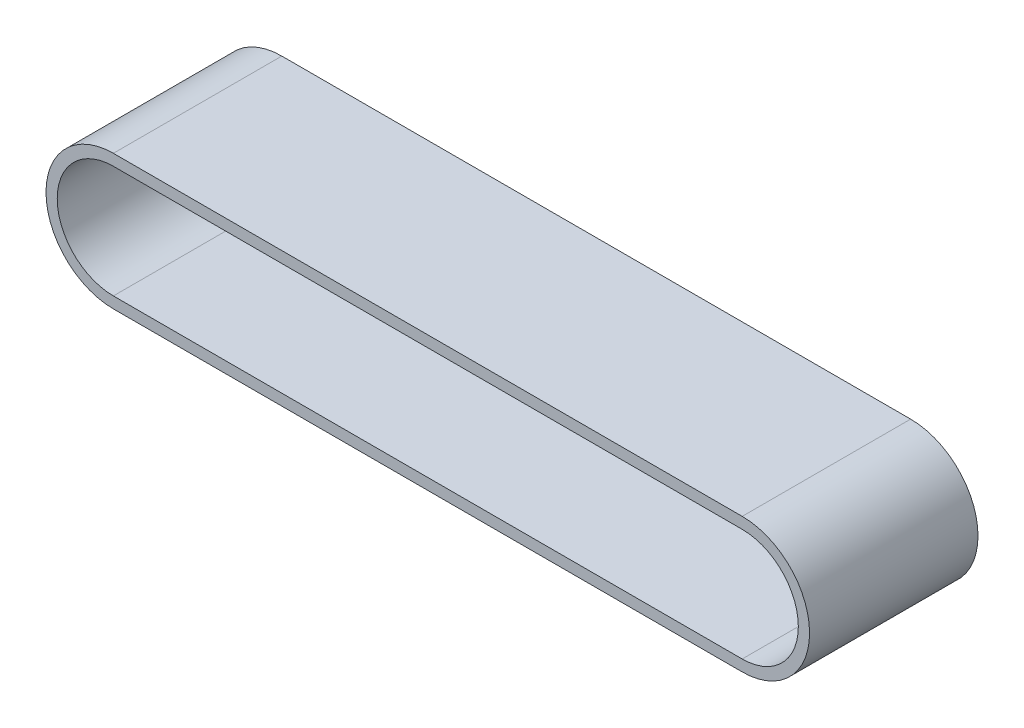
ISO-10303-21;
HEADER;
FILE_DESCRIPTION(('STEP AP214'),'2;1');
FILE_NAME('part.step','',(''),(''),'','','');
FILE_SCHEMA(('AUTOMOTIVE_DESIGN { 1 0 10303 214 1 1 1 1 }'));
ENDSEC;
DATA;
#1=APPLICATION_CONTEXT('core data for automotive mechanical design processes');
#2=APPLICATION_PROTOCOL_DEFINITION('international standard','automotive_design',2000,#1);
#3=PRODUCT_CONTEXT('',#1,'mechanical');
#4=PRODUCT('Part','Part','',(#3));
#5=PRODUCT_RELATED_PRODUCT_CATEGORY('part','',(#4));
#6=PRODUCT_DEFINITION_FORMATION('','',#4);
#7=PRODUCT_DEFINITION_CONTEXT('part definition',#1,'design');
#8=PRODUCT_DEFINITION('design','',#6,#7);
#9=PRODUCT_DEFINITION_SHAPE('','',#8);
#10=(LENGTH_UNIT() NAMED_UNIT(*) SI_UNIT(.MILLI.,.METRE.));
#11=(NAMED_UNIT(*) PLANE_ANGLE_UNIT() SI_UNIT($,.RADIAN.));
#12=(NAMED_UNIT(*) SI_UNIT($,.STERADIAN.) SOLID_ANGLE_UNIT());
#13=UNCERTAINTY_MEASURE_WITH_UNIT(LENGTH_MEASURE(1.E-05),#10,'distance_accuracy_value','');
#14=(GEOMETRIC_REPRESENTATION_CONTEXT(3) GLOBAL_UNCERTAINTY_ASSIGNED_CONTEXT((#13)) GLOBAL_UNIT_ASSIGNED_CONTEXT((#10,
#11,#12)) REPRESENTATION_CONTEXT('',''));
#15=CARTESIAN_POINT('',(0.,0.,0.));
#16=DIRECTION('',(0.,0.,1.));
#17=DIRECTION('',(1.,0.,0.));
#18=AXIS2_PLACEMENT_3D('',#15,#16,#17);
#19=CARTESIAN_POINT('',(0.,0.,75.));
#20=DIRECTION('',(0.,0.,1.));
#21=DIRECTION('',(1.,0.,0.));
#22=AXIS2_PLACEMENT_3D('',#19,#20,#21);
#23=PLANE('',#22);
#24=CARTESIAN_POINT('',(0.,0.,75.));
#25=DIRECTION('',(0.,0.,1.));
#26=DIRECTION('',(1.,0.,0.));
#27=AXIS2_PLACEMENT_3D('',#24,#25,#26);
#28=CIRCLE('',#27,30.);
#29=CARTESIAN_POINT('',(0.,30.,75.));
#30=VERTEX_POINT('',#29);
#31=CARTESIAN_POINT('',(0.,-30.,75.));
#32=VERTEX_POINT('',#31);
#33=EDGE_CURVE('E157',#30,#32,#28,.T.);
#34=ORIENTED_EDGE('',*,*,#33,.T.);
#35=DIRECTION('',(1.,0.,0.));
#36=VECTOR('',#35,1.);
#37=CARTESIAN_POINT('',(0.,-30.,75.));
#38=LINE('',#37,#36);
#39=CARTESIAN_POINT('',(280.,-30.,75.));
#40=VERTEX_POINT('',#39);
#41=EDGE_CURVE('E161',#32,#40,#38,.T.);
#42=ORIENTED_EDGE('',*,*,#41,.T.);
#43=CARTESIAN_POINT('',(280.,0.,75.));
#44=DIRECTION('',(0.,0.,1.));
#45=DIRECTION('',(1.,0.,0.));
#46=AXIS2_PLACEMENT_3D('',#43,#44,#45);
#47=CIRCLE('',#46,30.);
#48=CARTESIAN_POINT('',(280.,30.,75.));
#49=VERTEX_POINT('',#48);
#50=EDGE_CURVE('E165',#40,#49,#47,.T.);
#51=ORIENTED_EDGE('',*,*,#50,.T.);
#52=DIRECTION('',(-1.,0.,0.));
#53=VECTOR('',#52,1.);
#54=CARTESIAN_POINT('',(0.,30.,75.));
#55=LINE('',#54,#53);
#56=EDGE_CURVE('E168',#49,#30,#55,.T.);
#57=ORIENTED_EDGE('',*,*,#56,.T.);
#58=EDGE_LOOP('',(#34,#42,#51,#57));
#59=FACE_BOUND('',#58,.T.);
#60=DIRECTION('',(1.,0.,0.));
#61=VECTOR('',#60,1.);
#62=CARTESIAN_POINT('',(0.,-25.,75.));
#63=LINE('',#62,#61);
#64=CARTESIAN_POINT('',(0.,-25.,75.));
#65=VERTEX_POINT('',#64);
#66=CARTESIAN_POINT('',(280.,-25.,75.));
#67=VERTEX_POINT('',#66);
#68=EDGE_CURVE('E118',#65,#67,#63,.T.);
#69=ORIENTED_EDGE('',*,*,#68,.F.);
#70=CARTESIAN_POINT('',(0.,0.,75.));
#71=DIRECTION('',(0.,0.,1.));
#72=DIRECTION('',(1.,0.,0.));
#73=AXIS2_PLACEMENT_3D('',#70,#71,#72);
#74=CIRCLE('',#73,25.);
#75=CARTESIAN_POINT('',(0.,25.,75.));
#76=VERTEX_POINT('',#75);
#77=EDGE_CURVE('E109',#76,#65,#74,.T.);
#78=ORIENTED_EDGE('',*,*,#77,.F.);
#79=DIRECTION('',(-1.,0.,0.));
#80=VECTOR('',#79,1.);
#81=CARTESIAN_POINT('',(0.,25.,75.));
#82=LINE('',#81,#80);
#83=CARTESIAN_POINT('',(280.,25.,75.));
#84=VERTEX_POINT('',#83);
#85=EDGE_CURVE('E135',#84,#76,#82,.T.);
#86=ORIENTED_EDGE('',*,*,#85,.F.);
#87=CARTESIAN_POINT('',(280.,0.,75.));
#88=DIRECTION('',(0.,0.,1.));
#89=DIRECTION('',(1.,0.,0.));
#90=AXIS2_PLACEMENT_3D('',#87,#88,#89);
#91=CIRCLE('',#90,25.);
#92=EDGE_CURVE('E131',#67,#84,#91,.T.);
#93=ORIENTED_EDGE('',*,*,#92,.F.);
#94=EDGE_LOOP('',(#69,#78,#86,#93));
#95=FACE_BOUND('',#94,.T.);
#96=ADVANCED_FACE('F43',(#59,#95),#23,.T.);
#97=CARTESIAN_POINT('',(0.,0.,0.));
#98=DIRECTION('',(0.,0.,1.));
#99=DIRECTION('',(1.,0.,0.));
#100=AXIS2_PLACEMENT_3D('',#97,#98,#99);
#101=PLANE('',#100);
#102=CARTESIAN_POINT('',(0.,0.,0.));
#103=DIRECTION('',(0.,0.,1.));
#104=DIRECTION('',(1.,0.,0.));
#105=AXIS2_PLACEMENT_3D('',#102,#103,#104);
#106=CIRCLE('',#105,30.);
#107=CARTESIAN_POINT('',(0.,30.,0.));
#108=VERTEX_POINT('',#107);
#109=CARTESIAN_POINT('',(0.,-30.,0.));
#110=VERTEX_POINT('',#109);
#111=EDGE_CURVE('E127',#108,#110,#106,.T.);
#112=ORIENTED_EDGE('',*,*,#111,.F.);
#113=DIRECTION('',(-1.,0.,0.));
#114=VECTOR('',#113,1.);
#115=CARTESIAN_POINT('',(0.,30.,0.));
#116=LINE('',#115,#114);
#117=CARTESIAN_POINT('',(280.,30.,0.));
#118=VERTEX_POINT('',#117);
#119=EDGE_CURVE('E162',#118,#108,#116,.T.);
#120=ORIENTED_EDGE('',*,*,#119,.F.);
#121=CARTESIAN_POINT('',(280.,0.,0.));
#122=DIRECTION('',(0.,0.,1.));
#123=DIRECTION('',(1.,0.,0.));
#124=AXIS2_PLACEMENT_3D('',#121,#122,#123);
#125=CIRCLE('',#124,30.);
#126=CARTESIAN_POINT('',(280.,-30.,0.));
#127=VERTEX_POINT('',#126);
#128=EDGE_CURVE('E178',#127,#118,#125,.T.);
#129=ORIENTED_EDGE('',*,*,#128,.F.);
#130=DIRECTION('',(1.,0.,0.));
#131=VECTOR('',#130,1.);
#132=CARTESIAN_POINT('',(0.,-30.,0.));
#133=LINE('',#132,#131);
#134=EDGE_CURVE('E175',#110,#127,#133,.T.);
#135=ORIENTED_EDGE('',*,*,#134,.F.);
#136=EDGE_LOOP('',(#112,#120,#129,#135));
#137=FACE_BOUND('',#136,.T.);
#138=CARTESIAN_POINT('',(0.,0.,0.));
#139=DIRECTION('',(0.,0.,1.));
#140=DIRECTION('',(1.,0.,0.));
#141=AXIS2_PLACEMENT_3D('',#138,#139,#140);
#142=CIRCLE('',#141,25.);
#143=CARTESIAN_POINT('',(0.,25.,0.));
#144=VERTEX_POINT('',#143);
#145=CARTESIAN_POINT('',(0.,-25.,0.));
#146=VERTEX_POINT('',#145);
#147=EDGE_CURVE('E67',#144,#146,#142,.T.);
#148=ORIENTED_EDGE('',*,*,#147,.T.);
#149=DIRECTION('',(1.,0.,0.));
#150=VECTOR('',#149,1.);
#151=CARTESIAN_POINT('',(0.,-25.,0.));
#152=LINE('',#151,#150);
#153=CARTESIAN_POINT('',(280.,-25.,0.));
#154=VERTEX_POINT('',#153);
#155=EDGE_CURVE('E125',#146,#154,#152,.T.);
#156=ORIENTED_EDGE('',*,*,#155,.T.);
#157=CARTESIAN_POINT('',(280.,0.,0.));
#158=DIRECTION('',(0.,0.,1.));
#159=DIRECTION('',(1.,0.,0.));
#160=AXIS2_PLACEMENT_3D('',#157,#158,#159);
#161=CIRCLE('',#160,25.);
#162=CARTESIAN_POINT('',(280.,25.,0.));
#163=VERTEX_POINT('',#162);
#164=EDGE_CURVE('E144',#154,#163,#161,.T.);
#165=ORIENTED_EDGE('',*,*,#164,.T.);
#166=DIRECTION('',(-1.,0.,0.));
#167=VECTOR('',#166,1.);
#168=CARTESIAN_POINT('',(0.,25.,0.));
#169=LINE('',#168,#167);
#170=EDGE_CURVE('E119',#163,#144,#169,.T.);
#171=ORIENTED_EDGE('',*,*,#170,.T.);
#172=EDGE_LOOP('',(#148,#156,#165,#171));
#173=FACE_BOUND('',#172,.T.);
#174=ADVANCED_FACE('F201',(#137,#173),#101,.F.);
#175=CARTESIAN_POINT('',(0.,0.,75.));
#176=DIRECTION('',(0.,0.,-1.));
#177=DIRECTION('',(-1.,0.,0.));
#178=AXIS2_PLACEMENT_3D('',#175,#176,#177);
#179=CYLINDRICAL_SURFACE('',#178,30.);
#180=ORIENTED_EDGE('',*,*,#111,.T.);
#181=DIRECTION('',(0.,0.,-1.));
#182=VECTOR('',#181,1.);
#183=CARTESIAN_POINT('',(0.,-30.,75.));
#184=LINE('',#183,#182);
#185=EDGE_CURVE('E11',#32,#110,#184,.T.);
#186=ORIENTED_EDGE('',*,*,#185,.F.);
#187=ORIENTED_EDGE('',*,*,#33,.F.);
#188=DIRECTION('',(0.,0.,-1.));
#189=VECTOR('',#188,1.);
#190=CARTESIAN_POINT('',(0.,30.,75.));
#191=LINE('',#190,#189);
#192=EDGE_CURVE('E171',#30,#108,#191,.T.);
#193=ORIENTED_EDGE('',*,*,#192,.T.);
#194=EDGE_LOOP('',(#180,#186,#187,#193));
#195=FACE_BOUND('',#194,.T.);
#196=ADVANCED_FACE('F45',(#195),#179,.T.);
#197=CARTESIAN_POINT('',(0.,-30.,75.));
#198=DIRECTION('',(0.,1.,0.));
#199=DIRECTION('',(0.,0.,1.));
#200=AXIS2_PLACEMENT_3D('',#197,#198,#199);
#201=PLANE('',#200);
#202=ORIENTED_EDGE('',*,*,#134,.T.);
#203=DIRECTION('',(0.,0.,-1.));
#204=VECTOR('',#203,1.);
#205=CARTESIAN_POINT('',(280.,-30.,75.));
#206=LINE('',#205,#204);
#207=EDGE_CURVE('E52',#40,#127,#206,.T.);
#208=ORIENTED_EDGE('',*,*,#207,.F.);
#209=ORIENTED_EDGE('',*,*,#41,.F.);
#210=ORIENTED_EDGE('',*,*,#185,.T.);
#211=EDGE_LOOP('',(#202,#208,#209,#210));
#212=FACE_BOUND('',#211,.T.);
#213=ADVANCED_FACE('F211',(#212),#201,.F.);
#214=CARTESIAN_POINT('',(280.,0.,75.));
#215=DIRECTION('',(0.,0.,-1.));
#216=DIRECTION('',(-1.,0.,0.));
#217=AXIS2_PLACEMENT_3D('',#214,#215,#216);
#218=CYLINDRICAL_SURFACE('',#217,30.);
#219=ORIENTED_EDGE('',*,*,#128,.T.);
#220=DIRECTION('',(0.,0.,-1.));
#221=VECTOR('',#220,1.);
#222=CARTESIAN_POINT('',(280.,30.,75.));
#223=LINE('',#222,#221);
#224=EDGE_CURVE('E186',#49,#118,#223,.T.);
#225=ORIENTED_EDGE('',*,*,#224,.F.);
#226=ORIENTED_EDGE('',*,*,#50,.F.);
#227=ORIENTED_EDGE('',*,*,#207,.T.);
#228=EDGE_LOOP('',(#219,#225,#226,#227));
#229=FACE_BOUND('',#228,.T.);
#230=ADVANCED_FACE('F195',(#229),#218,.T.);
#231=CARTESIAN_POINT('',(0.,30.,75.));
#232=DIRECTION('',(0.,-1.,0.));
#233=DIRECTION('',(0.,0.,-1.));
#234=AXIS2_PLACEMENT_3D('',#231,#232,#233);
#235=PLANE('',#234);
#236=ORIENTED_EDGE('',*,*,#119,.T.);
#237=ORIENTED_EDGE('',*,*,#192,.F.);
#238=ORIENTED_EDGE('',*,*,#56,.F.);
#239=ORIENTED_EDGE('',*,*,#224,.T.);
#240=EDGE_LOOP('',(#236,#237,#238,#239));
#241=FACE_BOUND('',#240,.T.);
#242=ADVANCED_FACE('F205',(#241),#235,.F.);
#243=CARTESIAN_POINT('',(0.,0.,75.));
#244=DIRECTION('',(0.,0.,-1.));
#245=DIRECTION('',(-1.,0.,0.));
#246=AXIS2_PLACEMENT_3D('',#243,#244,#245);
#247=CYLINDRICAL_SURFACE('',#246,25.);
#248=ORIENTED_EDGE('',*,*,#147,.F.);
#249=DIRECTION('',(0.,0.,-1.));
#250=VECTOR('',#249,1.);
#251=CARTESIAN_POINT('',(0.,25.,75.));
#252=LINE('',#251,#250);
#253=EDGE_CURVE('E113',#76,#144,#252,.T.);
#254=ORIENTED_EDGE('',*,*,#253,.F.);
#255=ORIENTED_EDGE('',*,*,#77,.T.);
#256=DIRECTION('',(0.,0.,-1.));
#257=VECTOR('',#256,1.);
#258=CARTESIAN_POINT('',(0.,-25.,75.));
#259=LINE('',#258,#257);
#260=EDGE_CURVE('E112',#65,#146,#259,.T.);
#261=ORIENTED_EDGE('',*,*,#260,.T.);
#262=EDGE_LOOP('',(#248,#254,#255,#261));
#263=FACE_BOUND('',#262,.T.);
#264=ADVANCED_FACE('F111',(#263),#247,.F.);
#265=CARTESIAN_POINT('',(0.,-25.,75.));
#266=DIRECTION('',(0.,1.,0.));
#267=DIRECTION('',(0.,0.,1.));
#268=AXIS2_PLACEMENT_3D('',#265,#266,#267);
#269=PLANE('',#268);
#270=ORIENTED_EDGE('',*,*,#155,.F.);
#271=ORIENTED_EDGE('',*,*,#260,.F.);
#272=ORIENTED_EDGE('',*,*,#68,.T.);
#273=DIRECTION('',(0.,0.,-1.));
#274=VECTOR('',#273,1.);
#275=CARTESIAN_POINT('',(280.,-25.,75.));
#276=LINE('',#275,#274);
#277=EDGE_CURVE('E128',#67,#154,#276,.T.);
#278=ORIENTED_EDGE('',*,*,#277,.T.);
#279=EDGE_LOOP('',(#270,#271,#272,#278));
#280=FACE_BOUND('',#279,.T.);
#281=ADVANCED_FACE('F122',(#280),#269,.T.);
#282=CARTESIAN_POINT('',(280.,0.,75.));
#283=DIRECTION('',(0.,0.,-1.));
#284=DIRECTION('',(-1.,0.,0.));
#285=AXIS2_PLACEMENT_3D('',#282,#283,#284);
#286=CYLINDRICAL_SURFACE('',#285,25.);
#287=ORIENTED_EDGE('',*,*,#164,.F.);
#288=ORIENTED_EDGE('',*,*,#277,.F.);
#289=ORIENTED_EDGE('',*,*,#92,.T.);
#290=DIRECTION('',(0.,0.,-1.));
#291=VECTOR('',#290,1.);
#292=CARTESIAN_POINT('',(280.,25.,75.));
#293=LINE('',#292,#291);
#294=EDGE_CURVE('E59',#84,#163,#293,.T.);
#295=ORIENTED_EDGE('',*,*,#294,.T.);
#296=EDGE_LOOP('',(#287,#288,#289,#295));
#297=FACE_BOUND('',#296,.T.);
#298=ADVANCED_FACE('F234',(#297),#286,.F.);
#299=CARTESIAN_POINT('',(0.,25.,75.));
#300=DIRECTION('',(0.,-1.,0.));
#301=DIRECTION('',(0.,0.,-1.));
#302=AXIS2_PLACEMENT_3D('',#299,#300,#301);
#303=PLANE('',#302);
#304=ORIENTED_EDGE('',*,*,#170,.F.);
#305=ORIENTED_EDGE('',*,*,#294,.F.);
#306=ORIENTED_EDGE('',*,*,#85,.T.);
#307=ORIENTED_EDGE('',*,*,#253,.T.);
#308=EDGE_LOOP('',(#304,#305,#306,#307));
#309=FACE_BOUND('',#308,.T.);
#310=ADVANCED_FACE('F238',(#309),#303,.T.);
#311=CLOSED_SHELL('',(#96,#174,#196,#213,#230,#242,#264,#281,#298,#310));
#312=MANIFOLD_SOLID_BREP('B2',#311);
#313=ADVANCED_BREP_SHAPE_REPRESENTATION('',(#18,#312),#14);
#314=SHAPE_DEFINITION_REPRESENTATION(#9,#313);
ENDSEC;
END-ISO-10303-21;
